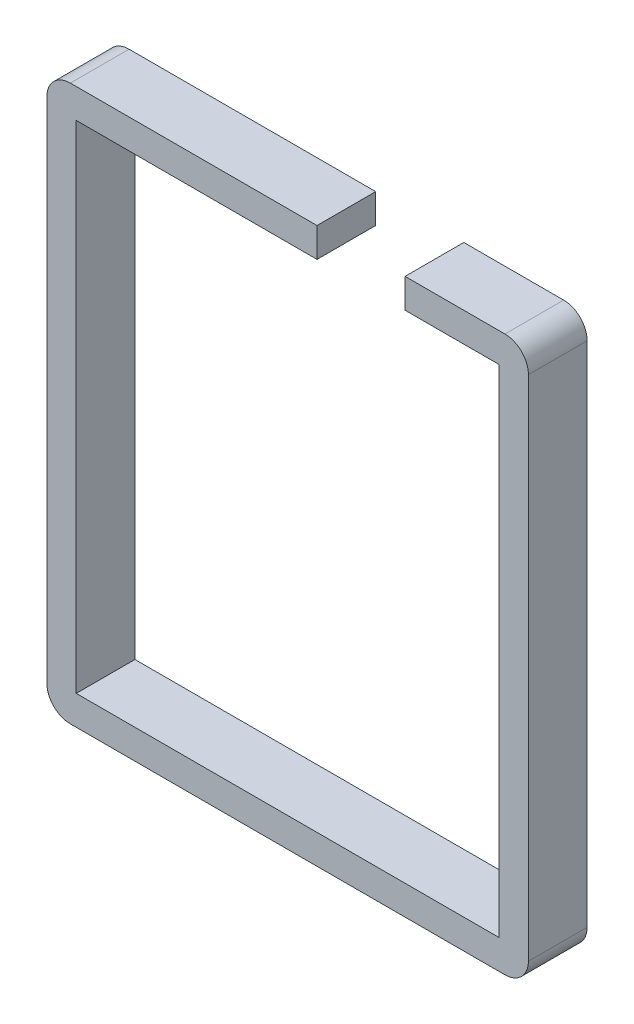
ISO-10303-21;
HEADER;
FILE_DESCRIPTION(('STEP AP214'),'2;1');
FILE_NAME('part.step','',(''),(''),'','','');
FILE_SCHEMA(('AUTOMOTIVE_DESIGN { 1 0 10303 214 1 1 1 1 }'));
ENDSEC;
DATA;
#1=APPLICATION_CONTEXT('core data for automotive mechanical design processes');
#2=APPLICATION_PROTOCOL_DEFINITION('international standard','automotive_design',2000,#1);
#3=PRODUCT_CONTEXT('',#1,'mechanical');
#4=PRODUCT('Part','Part','',(#3));
#5=PRODUCT_RELATED_PRODUCT_CATEGORY('part','',(#4));
#6=PRODUCT_DEFINITION_FORMATION('','',#4);
#7=PRODUCT_DEFINITION_CONTEXT('part definition',#1,'design');
#8=PRODUCT_DEFINITION('design','',#6,#7);
#9=PRODUCT_DEFINITION_SHAPE('','',#8);
#10=(LENGTH_UNIT() NAMED_UNIT(*) SI_UNIT(.MILLI.,.METRE.));
#11=(NAMED_UNIT(*) PLANE_ANGLE_UNIT() SI_UNIT($,.RADIAN.));
#12=(NAMED_UNIT(*) SI_UNIT($,.STERADIAN.) SOLID_ANGLE_UNIT());
#13=UNCERTAINTY_MEASURE_WITH_UNIT(LENGTH_MEASURE(1.E-05),#10,'distance_accuracy_value','');
#14=(GEOMETRIC_REPRESENTATION_CONTEXT(3) GLOBAL_UNCERTAINTY_ASSIGNED_CONTEXT((#13)) GLOBAL_UNIT_ASSIGNED_CONTEXT((#10,
#11,#12)) REPRESENTATION_CONTEXT('',''));
#15=CARTESIAN_POINT('',(0.,0.,0.));
#16=DIRECTION('',(0.,0.,1.));
#17=DIRECTION('',(1.,0.,0.));
#18=AXIS2_PLACEMENT_3D('',#15,#16,#17);
#19=CARTESIAN_POINT('',(0.,0.,0.));
#20=DIRECTION('',(0.,0.,1.));
#21=DIRECTION('',(1.,0.,0.));
#22=AXIS2_PLACEMENT_3D('',#19,#20,#21);
#23=PLANE('',#22);
#24=DIRECTION('',(1.,0.,0.));
#25=VECTOR('',#24,1.);
#26=CARTESIAN_POINT('',(0.,0.,0.));
#27=LINE('',#26,#25);
#28=CARTESIAN_POINT('',(4.,0.,0.));
#29=VERTEX_POINT('',#28);
#30=CARTESIAN_POINT('',(78.,0.,0.));
#31=VERTEX_POINT('',#30);
#32=EDGE_CURVE('E291',#29,#31,#27,.T.);
#33=ORIENTED_EDGE('',*,*,#32,.F.);
#34=CARTESIAN_POINT('',(4.,4.,0.));
#35=DIRECTION('',(0.,0.,1.));
#36=DIRECTION('',(1.,0.,0.));
#37=AXIS2_PLACEMENT_3D('',#34,#35,#36);
#38=CIRCLE('',#37,4.);
#39=CARTESIAN_POINT('',(0.,4.,0.));
#40=VERTEX_POINT('',#39);
#41=EDGE_CURVE('E335',#29,#40,#38,.F.);
#42=ORIENTED_EDGE('',*,*,#41,.T.);
#43=DIRECTION('',(0.,-1.,0.));
#44=VECTOR('',#43,1.);
#45=CARTESIAN_POINT('',(0.,0.,0.));
#46=LINE('',#45,#44);
#47=CARTESIAN_POINT('',(0.,90.5,0.));
#48=VERTEX_POINT('',#47);
#49=EDGE_CURVE('E288',#48,#40,#46,.T.);
#50=ORIENTED_EDGE('',*,*,#49,.F.);
#51=CARTESIAN_POINT('',(3.99999999999999,90.5,0.));
#52=DIRECTION('',(0.,0.,1.));
#53=DIRECTION('',(1.,0.,0.));
#54=AXIS2_PLACEMENT_3D('',#51,#52,#53);
#55=CIRCLE('',#54,4.);
#56=CARTESIAN_POINT('',(3.99999999999999,94.5,0.));
#57=VERTEX_POINT('',#56);
#58=EDGE_CURVE('E329',#48,#57,#55,.F.);
#59=ORIENTED_EDGE('',*,*,#58,.T.);
#60=DIRECTION('',(1.,0.,0.));
#61=VECTOR('',#60,1.);
#62=CARTESIAN_POINT('',(0.,94.5,0.));
#63=LINE('',#62,#61);
#64=CARTESIAN_POINT('',(46.,94.5,0.));
#65=VERTEX_POINT('',#64);
#66=EDGE_CURVE('E286',#57,#65,#63,.T.);
#67=ORIENTED_EDGE('',*,*,#66,.T.);
#68=DIRECTION('',(0.,-1.,0.));
#69=VECTOR('',#68,1.);
#70=CARTESIAN_POINT('',(46.,0.,0.));
#71=LINE('',#70,#69);
#72=CARTESIAN_POINT('',(46.,89.5,0.));
#73=VERTEX_POINT('',#72);
#74=EDGE_CURVE('E284',#65,#73,#71,.T.);
#75=ORIENTED_EDGE('',*,*,#74,.T.);
#76=DIRECTION('',(-1.,0.,0.));
#77=VECTOR('',#76,1.);
#78=CARTESIAN_POINT('',(0.,89.5,0.));
#79=LINE('',#78,#77);
#80=CARTESIAN_POINT('',(5.,89.5,0.));
#81=VERTEX_POINT('',#80);
#82=EDGE_CURVE('E239',#73,#81,#79,.T.);
#83=ORIENTED_EDGE('',*,*,#82,.T.);
#84=DIRECTION('',(0.,1.,0.));
#85=VECTOR('',#84,1.);
#86=CARTESIAN_POINT('',(5.,0.,0.));
#87=LINE('',#86,#85);
#88=CARTESIAN_POINT('',(5.,4.99999999999999,0.));
#89=VERTEX_POINT('',#88);
#90=EDGE_CURVE('E255',#89,#81,#87,.T.);
#91=ORIENTED_EDGE('',*,*,#90,.F.);
#92=DIRECTION('',(-1.,0.,0.));
#93=VECTOR('',#92,1.);
#94=CARTESIAN_POINT('',(0.,4.99999999999999,0.));
#95=LINE('',#94,#93);
#96=CARTESIAN_POINT('',(77.,4.99999999999999,0.));
#97=VERTEX_POINT('',#96);
#98=EDGE_CURVE('E305',#97,#89,#95,.T.);
#99=ORIENTED_EDGE('',*,*,#98,.F.);
#100=DIRECTION('',(0.,-1.,0.));
#101=VECTOR('',#100,1.);
#102=CARTESIAN_POINT('',(77.,0.,0.));
#103=LINE('',#102,#101);
#104=CARTESIAN_POINT('',(77.,89.5,0.));
#105=VERTEX_POINT('',#104);
#106=EDGE_CURVE('E303',#105,#97,#103,.T.);
#107=ORIENTED_EDGE('',*,*,#106,.F.);
#108=DIRECTION('',(1.,0.,0.));
#109=VECTOR('',#108,1.);
#110=CARTESIAN_POINT('',(0.,89.5,0.));
#111=LINE('',#110,#109);
#112=CARTESIAN_POINT('',(61.,89.5,0.));
#113=VERTEX_POINT('',#112);
#114=EDGE_CURVE('E301',#113,#105,#111,.T.);
#115=ORIENTED_EDGE('',*,*,#114,.F.);
#116=DIRECTION('',(0.,-1.,0.));
#117=VECTOR('',#116,1.);
#118=CARTESIAN_POINT('',(61.,0.,0.));
#119=LINE('',#118,#117);
#120=CARTESIAN_POINT('',(61.,94.5,0.));
#121=VERTEX_POINT('',#120);
#122=EDGE_CURVE('E299',#121,#113,#119,.T.);
#123=ORIENTED_EDGE('',*,*,#122,.F.);
#124=DIRECTION('',(1.,0.,0.));
#125=VECTOR('',#124,1.);
#126=CARTESIAN_POINT('',(2.62290189567694E-13,94.5000000000002,0.));
#127=LINE('',#126,#125);
#128=CARTESIAN_POINT('',(78.,94.5,0.));
#129=VERTEX_POINT('',#128);
#130=EDGE_CURVE('E296',#121,#129,#127,.T.);
#131=ORIENTED_EDGE('',*,*,#130,.T.);
#132=CARTESIAN_POINT('',(78.,90.5,0.));
#133=DIRECTION('',(0.,0.,1.));
#134=DIRECTION('',(1.,0.,0.));
#135=AXIS2_PLACEMENT_3D('',#132,#133,#134);
#136=CIRCLE('',#135,4.);
#137=CARTESIAN_POINT('',(82.,90.5,0.));
#138=VERTEX_POINT('',#137);
#139=EDGE_CURVE('E331',#129,#138,#136,.F.);
#140=ORIENTED_EDGE('',*,*,#139,.T.);
#141=DIRECTION('',(0.,1.,0.));
#142=VECTOR('',#141,1.);
#143=CARTESIAN_POINT('',(82.,0.,0.));
#144=LINE('',#143,#142);
#145=CARTESIAN_POINT('',(82.,4.,0.));
#146=VERTEX_POINT('',#145);
#147=EDGE_CURVE('E294',#146,#138,#144,.T.);
#148=ORIENTED_EDGE('',*,*,#147,.F.);
#149=CARTESIAN_POINT('',(78.,4.,0.));
#150=DIRECTION('',(0.,0.,1.));
#151=DIRECTION('',(1.,0.,0.));
#152=AXIS2_PLACEMENT_3D('',#149,#150,#151);
#153=CIRCLE('',#152,4.);
#154=EDGE_CURVE('E333',#146,#31,#153,.F.);
#155=ORIENTED_EDGE('',*,*,#154,.T.);
#156=EDGE_LOOP('',(#33,#42,#50,#59,#67,#75,#83,#91,#99,#107,#115,#123,#131,#140,#148,#155));
#157=FACE_BOUND('',#156,.T.);
#158=ADVANCED_FACE('F119',(#157),#23,.F.);
#159=CARTESIAN_POINT('',(0.,0.,10.));
#160=DIRECTION('',(1.,0.,0.));
#161=DIRECTION('',(0.,1.,0.));
#162=AXIS2_PLACEMENT_3D('',#159,#160,#161);
#163=PLANE('',#162);
#164=ORIENTED_EDGE('',*,*,#49,.T.);
#165=DIRECTION('',(0.,0.,-1.));
#166=VECTOR('',#165,1.);
#167=CARTESIAN_POINT('',(0.,4.,10.));
#168=LINE('',#167,#166);
#169=CARTESIAN_POINT('',(0.,4.,10.));
#170=VERTEX_POINT('',#169);
#171=EDGE_CURVE('E340',#40,#170,#168,.F.);
#172=ORIENTED_EDGE('',*,*,#171,.T.);
#173=DIRECTION('',(0.,-1.,0.));
#174=VECTOR('',#173,1.);
#175=CARTESIAN_POINT('',(0.,0.,10.));
#176=LINE('',#175,#174);
#177=CARTESIAN_POINT('',(0.,90.5,10.));
#178=VERTEX_POINT('',#177);
#179=EDGE_CURVE('E262',#178,#170,#176,.T.);
#180=ORIENTED_EDGE('',*,*,#179,.F.);
#181=DIRECTION('',(0.,0.,-1.));
#182=VECTOR('',#181,1.);
#183=CARTESIAN_POINT('',(0.,90.5,0.));
#184=LINE('',#183,#182);
#185=EDGE_CURVE('E337',#178,#48,#184,.T.);
#186=ORIENTED_EDGE('',*,*,#185,.T.);
#187=EDGE_LOOP('',(#164,#172,#180,#186));
#188=FACE_BOUND('',#187,.T.);
#189=ADVANCED_FACE('F394',(#188),#163,.F.);
#190=CARTESIAN_POINT('',(0.,94.5,10.));
#191=DIRECTION('',(0.,1.,0.));
#192=DIRECTION('',(0.,0.,1.));
#193=AXIS2_PLACEMENT_3D('',#190,#191,#192);
#194=PLANE('',#193);
#195=ORIENTED_EDGE('',*,*,#66,.F.);
#196=DIRECTION('',(0.,0.,-1.));
#197=VECTOR('',#196,1.);
#198=CARTESIAN_POINT('',(3.99999999999999,94.5,10.));
#199=LINE('',#198,#197);
#200=CARTESIAN_POINT('',(3.99999999999999,94.5,10.));
#201=VERTEX_POINT('',#200);
#202=EDGE_CURVE('E12',#57,#201,#199,.F.);
#203=ORIENTED_EDGE('',*,*,#202,.T.);
#204=DIRECTION('',(1.,0.,0.));
#205=VECTOR('',#204,1.);
#206=CARTESIAN_POINT('',(0.,94.5,10.));
#207=LINE('',#206,#205);
#208=CARTESIAN_POINT('',(46.,94.5,10.));
#209=VERTEX_POINT('',#208);
#210=EDGE_CURVE('E260',#201,#209,#207,.T.);
#211=ORIENTED_EDGE('',*,*,#210,.T.);
#212=DIRECTION('',(0.,0.,-1.));
#213=VECTOR('',#212,1.);
#214=CARTESIAN_POINT('',(46.,94.5,10.));
#215=LINE('',#214,#213);
#216=EDGE_CURVE('E245',#209,#65,#215,.T.);
#217=ORIENTED_EDGE('',*,*,#216,.T.);
#218=EDGE_LOOP('',(#195,#203,#211,#217));
#219=FACE_BOUND('',#218,.T.);
#220=ADVANCED_FACE('F388',(#219),#194,.T.);
#221=CARTESIAN_POINT('',(46.,0.,10.));
#222=DIRECTION('',(1.,0.,0.));
#223=DIRECTION('',(0.,0.,-1.));
#224=AXIS2_PLACEMENT_3D('',#221,#222,#223);
#225=PLANE('',#224);
#226=ORIENTED_EDGE('',*,*,#74,.F.);
#227=ORIENTED_EDGE('',*,*,#216,.F.);
#228=DIRECTION('',(0.,-1.,0.));
#229=VECTOR('',#228,1.);
#230=CARTESIAN_POINT('',(46.,0.,10.));
#231=LINE('',#230,#229);
#232=CARTESIAN_POINT('',(46.,89.5,10.));
#233=VERTEX_POINT('',#232);
#234=EDGE_CURVE('E251',#209,#233,#231,.T.);
#235=ORIENTED_EDGE('',*,*,#234,.T.);
#236=DIRECTION('',(0.,0.,-1.));
#237=VECTOR('',#236,1.);
#238=CARTESIAN_POINT('',(46.,89.5,10.));
#239=LINE('',#238,#237);
#240=EDGE_CURVE('E234',#233,#73,#239,.T.);
#241=ORIENTED_EDGE('',*,*,#240,.T.);
#242=EDGE_LOOP('',(#226,#227,#235,#241));
#243=FACE_BOUND('',#242,.T.);
#244=ADVANCED_FACE('F258',(#243),#225,.T.);
#245=CARTESIAN_POINT('',(0.,89.5,10.));
#246=DIRECTION('',(0.,-1.,0.));
#247=DIRECTION('',(0.,0.,-1.));
#248=AXIS2_PLACEMENT_3D('',#245,#246,#247);
#249=PLANE('',#248);
#250=ORIENTED_EDGE('',*,*,#82,.F.);
#251=ORIENTED_EDGE('',*,*,#240,.F.);
#252=DIRECTION('',(-1.,0.,0.));
#253=VECTOR('',#252,1.);
#254=CARTESIAN_POINT('',(0.,89.5,10.));
#255=LINE('',#254,#253);
#256=CARTESIAN_POINT('',(5.,89.5,10.));
#257=VERTEX_POINT('',#256);
#258=EDGE_CURVE('E237',#233,#257,#255,.T.);
#259=ORIENTED_EDGE('',*,*,#258,.T.);
#260=DIRECTION('',(0.,0.,-1.));
#261=VECTOR('',#260,1.);
#262=CARTESIAN_POINT('',(5.,89.5,10.));
#263=LINE('',#262,#261);
#264=EDGE_CURVE('E282',#257,#81,#263,.T.);
#265=ORIENTED_EDGE('',*,*,#264,.T.);
#266=EDGE_LOOP('',(#250,#251,#259,#265));
#267=FACE_BOUND('',#266,.T.);
#268=ADVANCED_FACE('F236',(#267),#249,.T.);
#269=CARTESIAN_POINT('',(5.,0.,10.));
#270=DIRECTION('',(-1.,0.,0.));
#271=DIRECTION('',(0.,0.,1.));
#272=AXIS2_PLACEMENT_3D('',#269,#270,#271);
#273=PLANE('',#272);
#274=ORIENTED_EDGE('',*,*,#90,.T.);
#275=ORIENTED_EDGE('',*,*,#264,.F.);
#276=DIRECTION('',(0.,1.,0.));
#277=VECTOR('',#276,1.);
#278=CARTESIAN_POINT('',(5.,0.,10.));
#279=LINE('',#278,#277);
#280=CARTESIAN_POINT('',(5.,4.99999999999999,10.));
#281=VERTEX_POINT('',#280);
#282=EDGE_CURVE('E253',#281,#257,#279,.T.);
#283=ORIENTED_EDGE('',*,*,#282,.F.);
#284=DIRECTION('',(0.,0.,-1.));
#285=VECTOR('',#284,1.);
#286=CARTESIAN_POINT('',(5.,4.99999999999999,10.));
#287=LINE('',#286,#285);
#288=EDGE_CURVE('E310',#281,#89,#287,.T.);
#289=ORIENTED_EDGE('',*,*,#288,.T.);
#290=EDGE_LOOP('',(#274,#275,#283,#289));
#291=FACE_BOUND('',#290,.T.);
#292=ADVANCED_FACE('F383',(#291),#273,.F.);
#293=CARTESIAN_POINT('',(0.,4.99999999999999,10.));
#294=DIRECTION('',(0.,-1.,0.));
#295=DIRECTION('',(1.,0.,0.));
#296=AXIS2_PLACEMENT_3D('',#293,#294,#295);
#297=PLANE('',#296);
#298=ORIENTED_EDGE('',*,*,#98,.T.);
#299=ORIENTED_EDGE('',*,*,#288,.F.);
#300=DIRECTION('',(-1.,0.,0.));
#301=VECTOR('',#300,1.);
#302=CARTESIAN_POINT('',(0.,4.99999999999999,10.));
#303=LINE('',#302,#301);
#304=CARTESIAN_POINT('',(77.,4.99999999999999,10.));
#305=VERTEX_POINT('',#304);
#306=EDGE_CURVE('E279',#305,#281,#303,.T.);
#307=ORIENTED_EDGE('',*,*,#306,.F.);
#308=DIRECTION('',(0.,0.,-1.));
#309=VECTOR('',#308,1.);
#310=CARTESIAN_POINT('',(77.,4.99999999999999,10.));
#311=LINE('',#310,#309);
#312=EDGE_CURVE('E313',#305,#97,#311,.T.);
#313=ORIENTED_EDGE('',*,*,#312,.T.);
#314=EDGE_LOOP('',(#298,#299,#307,#313));
#315=FACE_BOUND('',#314,.T.);
#316=ADVANCED_FACE('F380',(#315),#297,.F.);
#317=CARTESIAN_POINT('',(77.,0.,10.));
#318=DIRECTION('',(1.,0.,0.));
#319=DIRECTION('',(0.,1.,0.));
#320=AXIS2_PLACEMENT_3D('',#317,#318,#319);
#321=PLANE('',#320);
#322=ORIENTED_EDGE('',*,*,#106,.T.);
#323=ORIENTED_EDGE('',*,*,#312,.F.);
#324=DIRECTION('',(0.,-1.,0.));
#325=VECTOR('',#324,1.);
#326=CARTESIAN_POINT('',(77.,0.,10.));
#327=LINE('',#326,#325);
#328=CARTESIAN_POINT('',(77.,89.5,10.));
#329=VERTEX_POINT('',#328);
#330=EDGE_CURVE('E277',#329,#305,#327,.T.);
#331=ORIENTED_EDGE('',*,*,#330,.F.);
#332=DIRECTION('',(0.,0.,-1.));
#333=VECTOR('',#332,1.);
#334=CARTESIAN_POINT('',(77.,89.5,10.));
#335=LINE('',#334,#333);
#336=EDGE_CURVE('E316',#329,#105,#335,.T.);
#337=ORIENTED_EDGE('',*,*,#336,.T.);
#338=EDGE_LOOP('',(#322,#323,#331,#337));
#339=FACE_BOUND('',#338,.T.);
#340=ADVANCED_FACE('F377',(#339),#321,.F.);
#341=CARTESIAN_POINT('',(0.,89.5,10.));
#342=DIRECTION('',(0.,1.,0.));
#343=DIRECTION('',(0.,0.,1.));
#344=AXIS2_PLACEMENT_3D('',#341,#342,#343);
#345=PLANE('',#344);
#346=ORIENTED_EDGE('',*,*,#114,.T.);
#347=ORIENTED_EDGE('',*,*,#336,.F.);
#348=DIRECTION('',(1.,0.,0.));
#349=VECTOR('',#348,1.);
#350=CARTESIAN_POINT('',(0.,89.5,10.));
#351=LINE('',#350,#349);
#352=CARTESIAN_POINT('',(61.,89.5,10.));
#353=VERTEX_POINT('',#352);
#354=EDGE_CURVE('E275',#353,#329,#351,.T.);
#355=ORIENTED_EDGE('',*,*,#354,.F.);
#356=DIRECTION('',(0.,0.,-1.));
#357=VECTOR('',#356,1.);
#358=CARTESIAN_POINT('',(61.,89.5,10.));
#359=LINE('',#358,#357);
#360=EDGE_CURVE('E319',#353,#113,#359,.T.);
#361=ORIENTED_EDGE('',*,*,#360,.T.);
#362=EDGE_LOOP('',(#346,#347,#355,#361));
#363=FACE_BOUND('',#362,.T.);
#364=ADVANCED_FACE('F370',(#363),#345,.F.);
#365=CARTESIAN_POINT('',(61.,0.,10.));
#366=DIRECTION('',(1.,0.,0.));
#367=DIRECTION('',(0.,0.,-1.));
#368=AXIS2_PLACEMENT_3D('',#365,#366,#367);
#369=PLANE('',#368);
#370=ORIENTED_EDGE('',*,*,#122,.T.);
#371=ORIENTED_EDGE('',*,*,#360,.F.);
#372=DIRECTION('',(0.,-1.,0.));
#373=VECTOR('',#372,1.);
#374=CARTESIAN_POINT('',(61.,0.,10.));
#375=LINE('',#374,#373);
#376=CARTESIAN_POINT('',(61.,94.5,10.));
#377=VERTEX_POINT('',#376);
#378=EDGE_CURVE('E273',#377,#353,#375,.T.);
#379=ORIENTED_EDGE('',*,*,#378,.F.);
#380=DIRECTION('',(0.,0.,-1.));
#381=VECTOR('',#380,1.);
#382=CARTESIAN_POINT('',(61.,94.5,10.));
#383=LINE('',#382,#381);
#384=EDGE_CURVE('E322',#377,#121,#383,.T.);
#385=ORIENTED_EDGE('',*,*,#384,.T.);
#386=EDGE_LOOP('',(#370,#371,#379,#385));
#387=FACE_BOUND('',#386,.T.);
#388=ADVANCED_FACE('F366',(#387),#369,.F.);
#389=CARTESIAN_POINT('',(2.62290189567694E-13,94.5000000000002,10.));
#390=DIRECTION('',(0.,1.,0.));
#391=DIRECTION('',(-1.,0.,0.));
#392=AXIS2_PLACEMENT_3D('',#389,#390,#391);
#393=PLANE('',#392);
#394=DIRECTION('',(1.,0.,0.));
#395=VECTOR('',#394,1.);
#396=CARTESIAN_POINT('',(2.62290189567694E-13,94.5000000000002,10.));
#397=LINE('',#396,#395);
#398=CARTESIAN_POINT('',(78.,94.5,10.));
#399=VERTEX_POINT('',#398);
#400=EDGE_CURVE('E271',#377,#399,#397,.T.);
#401=ORIENTED_EDGE('',*,*,#400,.T.);
#402=DIRECTION('',(0.,0.,-1.));
#403=VECTOR('',#402,1.);
#404=CARTESIAN_POINT('',(78.,94.5,0.));
#405=LINE('',#404,#403);
#406=EDGE_CURVE('E127',#399,#129,#405,.T.);
#407=ORIENTED_EDGE('',*,*,#406,.T.);
#408=ORIENTED_EDGE('',*,*,#130,.F.);
#409=ORIENTED_EDGE('',*,*,#384,.F.);
#410=EDGE_LOOP('',(#401,#407,#408,#409));
#411=FACE_BOUND('',#410,.T.);
#412=ADVANCED_FACE('F356',(#411),#393,.T.);
#413=CARTESIAN_POINT('',(82.,0.,10.));
#414=DIRECTION('',(-1.,0.,0.));
#415=DIRECTION('',(0.,0.,1.));
#416=AXIS2_PLACEMENT_3D('',#413,#414,#415);
#417=PLANE('',#416);
#418=DIRECTION('',(0.,1.,0.));
#419=VECTOR('',#418,1.);
#420=CARTESIAN_POINT('',(82.,0.,10.));
#421=LINE('',#420,#419);
#422=CARTESIAN_POINT('',(82.,4.,10.));
#423=VERTEX_POINT('',#422);
#424=CARTESIAN_POINT('',(82.,90.5,10.));
#425=VERTEX_POINT('',#424);
#426=EDGE_CURVE('E269',#423,#425,#421,.T.);
#427=ORIENTED_EDGE('',*,*,#426,.F.);
#428=DIRECTION('',(0.,0.,-1.));
#429=VECTOR('',#428,1.);
#430=CARTESIAN_POINT('',(82.,4.,10.));
#431=LINE('',#430,#429);
#432=EDGE_CURVE('E350',#423,#146,#431,.T.);
#433=ORIENTED_EDGE('',*,*,#432,.T.);
#434=ORIENTED_EDGE('',*,*,#147,.T.);
#435=DIRECTION('',(0.,0.,-1.));
#436=VECTOR('',#435,1.);
#437=CARTESIAN_POINT('',(82.,90.5,10.));
#438=LINE('',#437,#436);
#439=EDGE_CURVE('E142',#138,#425,#438,.F.);
#440=ORIENTED_EDGE('',*,*,#439,.T.);
#441=EDGE_LOOP('',(#427,#433,#434,#440));
#442=FACE_BOUND('',#441,.T.);
#443=ADVANCED_FACE('F408',(#442),#417,.F.);
#444=CARTESIAN_POINT('',(0.,0.,10.));
#445=DIRECTION('',(0.,1.,0.));
#446=DIRECTION('',(0.,0.,1.));
#447=AXIS2_PLACEMENT_3D('',#444,#445,#446);
#448=PLANE('',#447);
#449=DIRECTION('',(1.,0.,0.));
#450=VECTOR('',#449,1.);
#451=CARTESIAN_POINT('',(0.,0.,10.));
#452=LINE('',#451,#450);
#453=CARTESIAN_POINT('',(4.,0.,10.));
#454=VERTEX_POINT('',#453);
#455=CARTESIAN_POINT('',(78.,0.,10.));
#456=VERTEX_POINT('',#455);
#457=EDGE_CURVE('E266',#454,#456,#452,.T.);
#458=ORIENTED_EDGE('',*,*,#457,.F.);
#459=DIRECTION('',(0.,0.,-1.));
#460=VECTOR('',#459,1.);
#461=CARTESIAN_POINT('',(4.,0.,10.));
#462=LINE('',#461,#460);
#463=EDGE_CURVE('E326',#454,#29,#462,.T.);
#464=ORIENTED_EDGE('',*,*,#463,.T.);
#465=ORIENTED_EDGE('',*,*,#32,.T.);
#466=DIRECTION('',(0.,0.,-1.));
#467=VECTOR('',#466,1.);
#468=CARTESIAN_POINT('',(78.,0.,10.));
#469=LINE('',#468,#467);
#470=EDGE_CURVE('E244',#31,#456,#469,.F.);
#471=ORIENTED_EDGE('',*,*,#470,.T.);
#472=EDGE_LOOP('',(#458,#464,#465,#471));
#473=FACE_BOUND('',#472,.T.);
#474=ADVANCED_FACE('F402',(#473),#448,.F.);
#475=CARTESIAN_POINT('',(0.,0.,10.));
#476=DIRECTION('',(0.,0.,1.));
#477=DIRECTION('',(1.,0.,0.));
#478=AXIS2_PLACEMENT_3D('',#475,#476,#477);
#479=PLANE('',#478);
#480=ORIENTED_EDGE('',*,*,#179,.T.);
#481=CARTESIAN_POINT('',(4.,4.,10.));
#482=DIRECTION('',(0.,0.,1.));
#483=DIRECTION('',(1.,0.,0.));
#484=AXIS2_PLACEMENT_3D('',#481,#482,#483);
#485=CIRCLE('',#484,4.);
#486=EDGE_CURVE('E347',#170,#454,#485,.T.);
#487=ORIENTED_EDGE('',*,*,#486,.T.);
#488=ORIENTED_EDGE('',*,*,#457,.T.);
#489=CARTESIAN_POINT('',(78.,4.,10.));
#490=DIRECTION('',(0.,0.,1.));
#491=DIRECTION('',(1.,0.,0.));
#492=AXIS2_PLACEMENT_3D('',#489,#490,#491);
#493=CIRCLE('',#492,4.);
#494=EDGE_CURVE('E345',#456,#423,#493,.T.);
#495=ORIENTED_EDGE('',*,*,#494,.T.);
#496=ORIENTED_EDGE('',*,*,#426,.T.);
#497=CARTESIAN_POINT('',(78.,90.5,10.));
#498=DIRECTION('',(0.,0.,1.));
#499=DIRECTION('',(1.,0.,0.));
#500=AXIS2_PLACEMENT_3D('',#497,#498,#499);
#501=CIRCLE('',#500,4.);
#502=EDGE_CURVE('E134',#425,#399,#501,.T.);
#503=ORIENTED_EDGE('',*,*,#502,.T.);
#504=ORIENTED_EDGE('',*,*,#400,.F.);
#505=ORIENTED_EDGE('',*,*,#378,.T.);
#506=ORIENTED_EDGE('',*,*,#354,.T.);
#507=ORIENTED_EDGE('',*,*,#330,.T.);
#508=ORIENTED_EDGE('',*,*,#306,.T.);
#509=ORIENTED_EDGE('',*,*,#282,.T.);
#510=ORIENTED_EDGE('',*,*,#258,.F.);
#511=ORIENTED_EDGE('',*,*,#234,.F.);
#512=ORIENTED_EDGE('',*,*,#210,.F.);
#513=CARTESIAN_POINT('',(3.99999999999999,90.5,10.));
#514=DIRECTION('',(0.,0.,1.));
#515=DIRECTION('',(1.,0.,0.));
#516=AXIS2_PLACEMENT_3D('',#513,#514,#515);
#517=CIRCLE('',#516,4.);
#518=EDGE_CURVE('E342',#201,#178,#517,.T.);
#519=ORIENTED_EDGE('',*,*,#518,.T.);
#520=EDGE_LOOP('',(#480,#487,#488,#495,#496,#503,#504,#505,#506,#507,#508,#509,#510,#511,#512,#519));
#521=FACE_BOUND('',#520,.T.);
#522=ADVANCED_FACE('F249',(#521),#479,.T.);
#523=CARTESIAN_POINT('',(4.,4.,10.));
#524=DIRECTION('',(0.,0.,-1.));
#525=DIRECTION('',(-1.,0.,0.));
#526=AXIS2_PLACEMENT_3D('',#523,#524,#525);
#527=CYLINDRICAL_SURFACE('',#526,4.);
#528=ORIENTED_EDGE('',*,*,#486,.F.);
#529=ORIENTED_EDGE('',*,*,#171,.F.);
#530=ORIENTED_EDGE('',*,*,#41,.F.);
#531=ORIENTED_EDGE('',*,*,#463,.F.);
#532=EDGE_LOOP('',(#528,#529,#530,#531));
#533=FACE_BOUND('',#532,.T.);
#534=ADVANCED_FACE('F399',(#533),#527,.T.);
#535=CARTESIAN_POINT('',(78.,4.,10.));
#536=DIRECTION('',(0.,0.,-1.));
#537=DIRECTION('',(-1.,0.,0.));
#538=AXIS2_PLACEMENT_3D('',#535,#536,#537);
#539=CYLINDRICAL_SURFACE('',#538,4.);
#540=ORIENTED_EDGE('',*,*,#494,.F.);
#541=ORIENTED_EDGE('',*,*,#470,.F.);
#542=ORIENTED_EDGE('',*,*,#154,.F.);
#543=ORIENTED_EDGE('',*,*,#432,.F.);
#544=EDGE_LOOP('',(#540,#541,#542,#543));
#545=FACE_BOUND('',#544,.T.);
#546=ADVANCED_FACE('F407',(#545),#539,.T.);
#547=CARTESIAN_POINT('',(78.,90.5,10.));
#548=DIRECTION('',(0.,0.,1.));
#549=DIRECTION('',(1.,0.,0.));
#550=AXIS2_PLACEMENT_3D('',#547,#548,#549);
#551=CYLINDRICAL_SURFACE('',#550,4.);
#552=ORIENTED_EDGE('',*,*,#502,.F.);
#553=ORIENTED_EDGE('',*,*,#439,.F.);
#554=ORIENTED_EDGE('',*,*,#139,.F.);
#555=ORIENTED_EDGE('',*,*,#406,.F.);
#556=EDGE_LOOP('',(#552,#553,#554,#555));
#557=FACE_BOUND('',#556,.T.);
#558=ADVANCED_FACE('F409',(#557),#551,.T.);
#559=CARTESIAN_POINT('',(3.99999999999999,90.5,10.));
#560=DIRECTION('',(0.,0.,1.));
#561=DIRECTION('',(1.,0.,0.));
#562=AXIS2_PLACEMENT_3D('',#559,#560,#561);
#563=CYLINDRICAL_SURFACE('',#562,4.);
#564=ORIENTED_EDGE('',*,*,#518,.F.);
#565=ORIENTED_EDGE('',*,*,#202,.F.);
#566=ORIENTED_EDGE('',*,*,#58,.F.);
#567=ORIENTED_EDGE('',*,*,#185,.F.);
#568=EDGE_LOOP('',(#564,#565,#566,#567));
#569=FACE_BOUND('',#568,.T.);
#570=ADVANCED_FACE('F121',(#569),#563,.T.);
#571=CLOSED_SHELL('',(#158,#189,#220,#244,#268,#292,#316,#340,#364,#388,#412,#443,#474,#522,
#534,#546,#558,#570));
#572=MANIFOLD_SOLID_BREP('B2',#571);
#573=ADVANCED_BREP_SHAPE_REPRESENTATION('',(#18,#572),#14);
#574=SHAPE_DEFINITION_REPRESENTATION(#9,#573);
ENDSEC;
END-ISO-10303-21;
